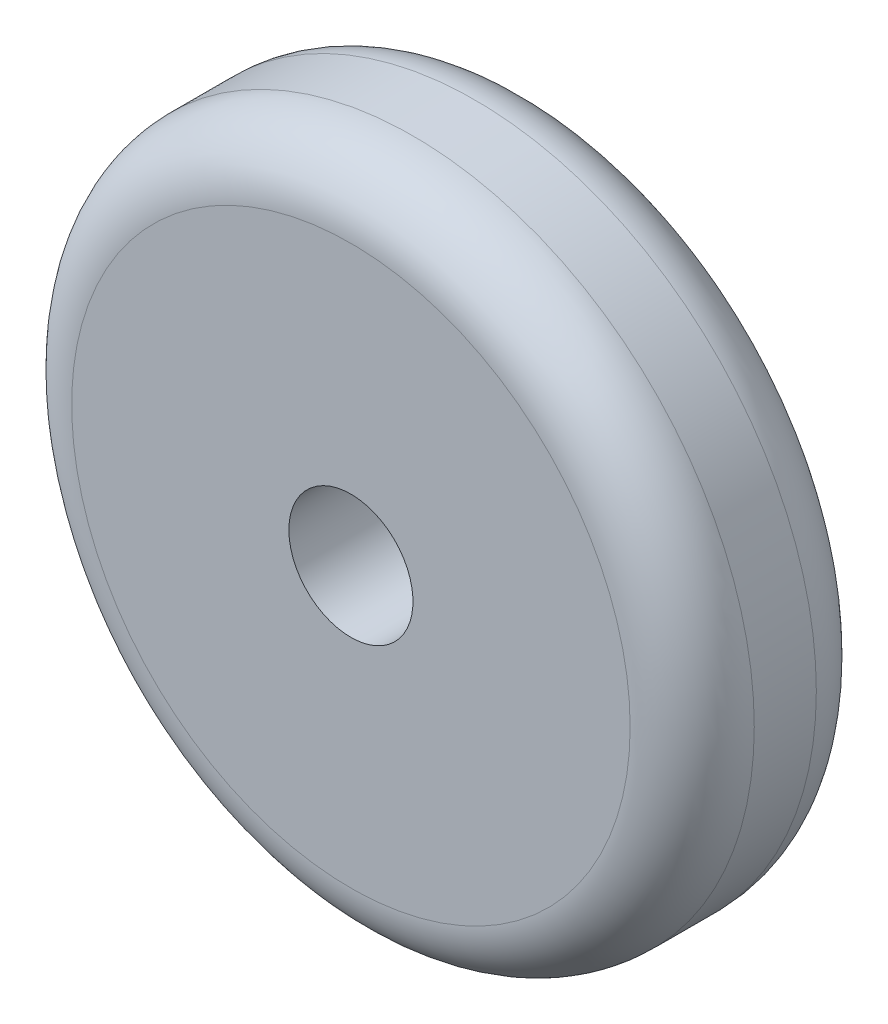
ISO-10303-21;
HEADER;
FILE_DESCRIPTION(('STEP AP214'),'2;1');
FILE_NAME('part.step','',(''),(''),'','','');
FILE_SCHEMA(('AUTOMOTIVE_DESIGN { 1 0 10303 214 1 1 1 1 }'));
ENDSEC;
DATA;
#1=APPLICATION_CONTEXT('core data for automotive mechanical design processes');
#2=APPLICATION_PROTOCOL_DEFINITION('international standard','automotive_design',2000,#1);
#3=PRODUCT_CONTEXT('',#1,'mechanical');
#4=PRODUCT('Part','Part','',(#3));
#5=PRODUCT_RELATED_PRODUCT_CATEGORY('part','',(#4));
#6=PRODUCT_DEFINITION_FORMATION('','',#4);
#7=PRODUCT_DEFINITION_CONTEXT('part definition',#1,'design');
#8=PRODUCT_DEFINITION('design','',#6,#7);
#9=PRODUCT_DEFINITION_SHAPE('','',#8);
#10=(LENGTH_UNIT() NAMED_UNIT(*) SI_UNIT(.MILLI.,.METRE.));
#11=(NAMED_UNIT(*) PLANE_ANGLE_UNIT() SI_UNIT($,.RADIAN.));
#12=(NAMED_UNIT(*) SI_UNIT($,.STERADIAN.) SOLID_ANGLE_UNIT());
#13=UNCERTAINTY_MEASURE_WITH_UNIT(LENGTH_MEASURE(1.E-05),#10,'distance_accuracy_value','');
#14=(GEOMETRIC_REPRESENTATION_CONTEXT(3) GLOBAL_UNCERTAINTY_ASSIGNED_CONTEXT((#13)) GLOBAL_UNIT_ASSIGNED_CONTEXT((#10,
#11,#12)) REPRESENTATION_CONTEXT('',''));
#15=CARTESIAN_POINT('',(0.,0.,0.));
#16=DIRECTION('',(0.,0.,1.));
#17=DIRECTION('',(1.,0.,0.));
#18=AXIS2_PLACEMENT_3D('',#15,#16,#17);
#19=CARTESIAN_POINT('',(0.,0.,7.62));
#20=DIRECTION('',(0.,0.,1.));
#21=DIRECTION('',(1.,0.,0.));
#22=AXIS2_PLACEMENT_3D('',#19,#20,#21);
#23=PLANE('',#22);
#24=CARTESIAN_POINT('',(0.,0.,7.62));
#25=DIRECTION('',(0.,0.,1.));
#26=DIRECTION('',(1.,0.,0.));
#27=AXIS2_PLACEMENT_3D('',#24,#25,#26);
#28=CIRCLE('',#27,11.43);
#29=CARTESIAN_POINT('',(11.43,0.,7.62));
#30=VERTEX_POINT('',#29);
#31=EDGE_CURVE('E10',#30,#30,#28,.T.);
#32=ORIENTED_EDGE('',*,*,#31,.T.);
#33=EDGE_LOOP('',(#32));
#34=FACE_BOUND('',#33,.T.);
#35=CARTESIAN_POINT('',(0.,0.,7.62));
#36=DIRECTION('',(0.,0.,1.));
#37=DIRECTION('',(1.,0.,0.));
#38=AXIS2_PLACEMENT_3D('',#35,#36,#37);
#39=CIRCLE('',#38,2.54);
#40=CARTESIAN_POINT('',(-2.54,0.,7.62));
#41=VERTEX_POINT('',#40);
#42=EDGE_CURVE('E51',#41,#41,#39,.T.);
#43=ORIENTED_EDGE('',*,*,#42,.F.);
#44=EDGE_LOOP('',(#43));
#45=FACE_BOUND('',#44,.T.);
#46=ADVANCED_FACE('F31',(#34,#45),#23,.T.);
#47=CARTESIAN_POINT('',(0.,0.,0.));
#48=DIRECTION('',(0.,0.,1.));
#49=DIRECTION('',(1.,0.,0.));
#50=AXIS2_PLACEMENT_3D('',#47,#48,#49);
#51=PLANE('',#50);
#52=CARTESIAN_POINT('',(0.,0.,0.));
#53=DIRECTION('',(0.,0.,1.));
#54=DIRECTION('',(1.,0.,0.));
#55=AXIS2_PLACEMENT_3D('',#52,#53,#54);
#56=CIRCLE('',#55,11.43);
#57=CARTESIAN_POINT('',(11.43,0.,0.));
#58=VERTEX_POINT('',#57);
#59=EDGE_CURVE('E38',#58,#58,#56,.F.);
#60=ORIENTED_EDGE('',*,*,#59,.T.);
#61=EDGE_LOOP('',(#60));
#62=FACE_BOUND('',#61,.T.);
#63=CARTESIAN_POINT('',(0.,0.,0.));
#64=DIRECTION('',(0.,0.,1.));
#65=DIRECTION('',(1.,0.,0.));
#66=AXIS2_PLACEMENT_3D('',#63,#64,#65);
#67=CIRCLE('',#66,2.54);
#68=CARTESIAN_POINT('',(-2.54,0.,0.));
#69=VERTEX_POINT('',#68);
#70=EDGE_CURVE('E52',#69,#69,#67,.T.);
#71=ORIENTED_EDGE('',*,*,#70,.T.);
#72=EDGE_LOOP('',(#71));
#73=FACE_BOUND('',#72,.T.);
#74=ADVANCED_FACE('F62',(#62,#73),#51,.F.);
#75=CARTESIAN_POINT('',(0.,0.,7.62));
#76=DIRECTION('',(0.,0.,-1.));
#77=DIRECTION('',(-1.,0.,0.));
#78=AXIS2_PLACEMENT_3D('',#75,#76,#77);
#79=CYLINDRICAL_SURFACE('',#78,13.97);
#80=CARTESIAN_POINT('',(0.,0.,2.54));
#81=DIRECTION('',(0.,0.,1.));
#82=DIRECTION('',(1.,0.,0.));
#83=AXIS2_PLACEMENT_3D('',#80,#81,#82);
#84=CIRCLE('',#83,13.97);
#85=CARTESIAN_POINT('',(-13.97,0.,2.54));
#86=VERTEX_POINT('',#85);
#87=EDGE_CURVE('E42',#86,#86,#84,.T.);
#88=CARTESIAN_POINT('',(0.,0.,5.08));
#89=DIRECTION('',(0.,0.,1.));
#90=DIRECTION('',(1.,0.,0.));
#91=AXIS2_PLACEMENT_3D('',#88,#89,#90);
#92=CIRCLE('',#91,13.97);
#93=CARTESIAN_POINT('',(-13.97,0.,5.08));
#94=VERTEX_POINT('',#93);
#95=EDGE_CURVE('E46',#94,#94,#92,.F.);
#96=CARTESIAN_POINT('',(-13.97,0.,2.54));
#97=CARTESIAN_POINT('',(-13.97,0.,2.56645833333333));
#98=CARTESIAN_POINT('',(-13.97,0.,2.59291666666667));
#99=CARTESIAN_POINT('',(-13.97,0.,2.64583333333333));
#100=CARTESIAN_POINT('',(-13.97,0.,2.67229166666667));
#101=CARTESIAN_POINT('',(-13.97,0.,2.72520833333333));
#102=CARTESIAN_POINT('',(-13.97,0.,2.75166666666667));
#103=CARTESIAN_POINT('',(-13.97,0.,2.80458333333333));
#104=CARTESIAN_POINT('',(-13.97,0.,2.83104166666667));
#105=CARTESIAN_POINT('',(-13.97,0.,2.88395833333333));
#106=CARTESIAN_POINT('',(-13.97,0.,2.91041666666667));
#107=CARTESIAN_POINT('',(-13.97,0.,2.96333333333333));
#108=CARTESIAN_POINT('',(-13.97,0.,2.98979166666667));
#109=CARTESIAN_POINT('',(-13.97,0.,3.04270833333333));
#110=CARTESIAN_POINT('',(-13.97,0.,3.06916666666667));
#111=CARTESIAN_POINT('',(-13.97,0.,3.12208333333333));
#112=CARTESIAN_POINT('',(-13.97,0.,3.14854166666667));
#113=CARTESIAN_POINT('',(-13.97,0.,3.20145833333333));
#114=CARTESIAN_POINT('',(-13.97,0.,3.22791666666667));
#115=CARTESIAN_POINT('',(-13.97,0.,3.28083333333333));
#116=CARTESIAN_POINT('',(-13.97,0.,3.30729166666667));
#117=CARTESIAN_POINT('',(-13.97,0.,3.36020833333333));
#118=CARTESIAN_POINT('',(-13.97,0.,3.38666666666667));
#119=CARTESIAN_POINT('',(-13.97,0.,3.43958333333333));
#120=CARTESIAN_POINT('',(-13.97,0.,3.46604166666667));
#121=CARTESIAN_POINT('',(-13.97,0.,3.51895833333333));
#122=CARTESIAN_POINT('',(-13.97,0.,3.54541666666667));
#123=CARTESIAN_POINT('',(-13.97,0.,3.59833333333333));
#124=CARTESIAN_POINT('',(-13.97,0.,3.62479166666667));
#125=CARTESIAN_POINT('',(-13.97,0.,3.67770833333333));
#126=CARTESIAN_POINT('',(-13.97,0.,3.70416666666667));
#127=CARTESIAN_POINT('',(-13.97,0.,3.75708333333333));
#128=CARTESIAN_POINT('',(-13.97,0.,3.78354166666667));
#129=CARTESIAN_POINT('',(-13.97,0.,3.83645833333333));
#130=CARTESIAN_POINT('',(-13.97,0.,3.86291666666667));
#131=CARTESIAN_POINT('',(-13.97,0.,3.91583333333333));
#132=CARTESIAN_POINT('',(-13.97,0.,3.94229166666666));
#133=CARTESIAN_POINT('',(-13.97,0.,3.99520833333333));
#134=CARTESIAN_POINT('',(-13.97,0.,4.02166666666667));
#135=CARTESIAN_POINT('',(-13.97,0.,4.07458333333333));
#136=CARTESIAN_POINT('',(-13.97,0.,4.10104166666667));
#137=CARTESIAN_POINT('',(-13.97,0.,4.15395833333333));
#138=CARTESIAN_POINT('',(-13.97,0.,4.18041666666667));
#139=CARTESIAN_POINT('',(-13.97,0.,4.23333333333333));
#140=CARTESIAN_POINT('',(-13.97,0.,4.25979166666666));
#141=CARTESIAN_POINT('',(-13.97,0.,4.31270833333333));
#142=CARTESIAN_POINT('',(-13.97,0.,4.33916666666667));
#143=CARTESIAN_POINT('',(-13.97,0.,4.39208333333333));
#144=CARTESIAN_POINT('',(-13.97,0.,4.41854166666667));
#145=CARTESIAN_POINT('',(-13.97,0.,4.47145833333333));
#146=CARTESIAN_POINT('',(-13.97,0.,4.49791666666667));
#147=CARTESIAN_POINT('',(-13.97,0.,4.55083333333333));
#148=CARTESIAN_POINT('',(-13.97,0.,4.57729166666667));
#149=CARTESIAN_POINT('',(-13.97,0.,4.63020833333333));
#150=CARTESIAN_POINT('',(-13.97,0.,4.65666666666667));
#151=CARTESIAN_POINT('',(-13.97,0.,4.70958333333333));
#152=CARTESIAN_POINT('',(-13.97,0.,4.73604166666667));
#153=CARTESIAN_POINT('',(-13.97,0.,4.78895833333333));
#154=CARTESIAN_POINT('',(-13.97,0.,4.81541666666667));
#155=CARTESIAN_POINT('',(-13.97,0.,4.86833333333333));
#156=CARTESIAN_POINT('',(-13.97,0.,4.89479166666667));
#157=CARTESIAN_POINT('',(-13.97,0.,4.94770833333333));
#158=CARTESIAN_POINT('',(-13.97,0.,4.97416666666667));
#159=CARTESIAN_POINT('',(-13.97,0.,5.02708333333333));
#160=CARTESIAN_POINT('',(-13.97,0.,5.05354166666667));
#161=CARTESIAN_POINT('',(-13.97,0.,5.08));
#162=B_SPLINE_CURVE_WITH_KNOTS('',3,(#96,#97,#98,#99,#100,#101,#102,#103,#104,#105,#106,#107,
#108,#109,#110,#111,#112,#113,#114,#115,#116,#117,#118,#119,#120,#121,#122,#123,#124,#125,#126,
#127,#128,#129,#130,#131,#132,#133,#134,#135,#136,#137,#138,#139,#140,#141,#142,#143,#144,#145,
#146,#147,#148,#149,#150,#151,#152,#153,#154,#155,#156,#157,#158,#159,#160,#161),.UNSPECIFIED.,
.F.,.F.,(4,2,2,2,2,2,2,2,2,2,2,2,2,2,2,2,2,2,2,2,2,2,2,2,2,2,2,2,2,2,2,2,4),(0.,
0.0793749999999996,0.15875,0.238125,0.3175,0.396875,0.47625,0.555625000000001,0.635,0.714375,
0.79375,0.873125000000001,0.9525,1.031875,1.11125,1.190625,1.27,1.349375,1.42875,1.508125,
1.5875,1.666875,1.74625,1.825625,1.905,1.984375,2.06375,2.143125,2.2225,2.301875,2.38125,
2.460625,2.54),.UNSPECIFIED.);
#163=EDGE_CURVE('BSEAM67',#86,#94,#162,.T.);
#164=ORIENTED_EDGE('',*,*,#87,.T.);
#165=ORIENTED_EDGE('',*,*,#95,.T.);
#166=ORIENTED_EDGE('',*,*,#163,.T.);
#167=ORIENTED_EDGE('',*,*,#163,.F.);
#168=EDGE_LOOP('',(#164,#166,#165,#167));
#169=FACE_BOUND('',#168,.T.);
#170=ADVANCED_FACE('F67',(#169),#79,.T.);
#171=CARTESIAN_POINT('',(0.,0.,7.62));
#172=DIRECTION('',(0.,0.,-1.));
#173=DIRECTION('',(-1.,0.,0.));
#174=AXIS2_PLACEMENT_3D('',#171,#172,#173);
#175=CYLINDRICAL_SURFACE('',#174,2.54);
#176=CARTESIAN_POINT('',(-2.54,0.,7.62));
#177=CARTESIAN_POINT('',(-2.54,0.,7.540625));
#178=CARTESIAN_POINT('',(-2.54,0.,7.46125));
#179=CARTESIAN_POINT('',(-2.54,0.,7.3025));
#180=CARTESIAN_POINT('',(-2.54,0.,7.223125));
#181=CARTESIAN_POINT('',(-2.54,0.,7.064375));
#182=CARTESIAN_POINT('',(-2.54,0.,6.985));
#183=CARTESIAN_POINT('',(-2.54,0.,6.82625));
#184=CARTESIAN_POINT('',(-2.54,0.,6.746875));
#185=CARTESIAN_POINT('',(-2.54,0.,6.588125));
#186=CARTESIAN_POINT('',(-2.54,0.,6.50875));
#187=CARTESIAN_POINT('',(-2.54,0.,6.35));
#188=CARTESIAN_POINT('',(-2.54,0.,6.270625));
#189=CARTESIAN_POINT('',(-2.54,0.,6.111875));
#190=CARTESIAN_POINT('',(-2.54,0.,6.0325));
#191=CARTESIAN_POINT('',(-2.54,0.,5.87375));
#192=CARTESIAN_POINT('',(-2.54,0.,5.794375));
#193=CARTESIAN_POINT('',(-2.54,0.,5.635625));
#194=CARTESIAN_POINT('',(-2.54,0.,5.55625));
#195=CARTESIAN_POINT('',(-2.54,0.,5.3975));
#196=CARTESIAN_POINT('',(-2.54,0.,5.318125));
#197=CARTESIAN_POINT('',(-2.54,0.,5.159375));
#198=CARTESIAN_POINT('',(-2.54,0.,5.08));
#199=CARTESIAN_POINT('',(-2.54,0.,4.92125));
#200=CARTESIAN_POINT('',(-2.54,0.,4.841875));
#201=CARTESIAN_POINT('',(-2.54,0.,4.683125));
#202=CARTESIAN_POINT('',(-2.54,0.,4.60375));
#203=CARTESIAN_POINT('',(-2.54,0.,4.445));
#204=CARTESIAN_POINT('',(-2.54,0.,4.365625));
#205=CARTESIAN_POINT('',(-2.54,0.,4.206875));
#206=CARTESIAN_POINT('',(-2.54,0.,4.1275));
#207=CARTESIAN_POINT('',(-2.54,0.,3.96875));
#208=CARTESIAN_POINT('',(-2.54,0.,3.889375));
#209=CARTESIAN_POINT('',(-2.54,0.,3.730625));
#210=CARTESIAN_POINT('',(-2.54,0.,3.65125));
#211=CARTESIAN_POINT('',(-2.54,0.,3.4925));
#212=CARTESIAN_POINT('',(-2.54,0.,3.413125));
#213=CARTESIAN_POINT('',(-2.54,0.,3.254375));
#214=CARTESIAN_POINT('',(-2.54,0.,3.175));
#215=CARTESIAN_POINT('',(-2.54,0.,3.01625));
#216=CARTESIAN_POINT('',(-2.54,0.,2.936875));
#217=CARTESIAN_POINT('',(-2.54,0.,2.778125));
#218=CARTESIAN_POINT('',(-2.54,0.,2.69875));
#219=CARTESIAN_POINT('',(-2.54,0.,2.54));
#220=CARTESIAN_POINT('',(-2.54,0.,2.460625));
#221=CARTESIAN_POINT('',(-2.54,0.,2.301875));
#222=CARTESIAN_POINT('',(-2.54,0.,2.2225));
#223=CARTESIAN_POINT('',(-2.54,0.,2.06375));
#224=CARTESIAN_POINT('',(-2.54,0.,1.984375));
#225=CARTESIAN_POINT('',(-2.54,0.,1.825625));
#226=CARTESIAN_POINT('',(-2.54,0.,1.74625));
#227=CARTESIAN_POINT('',(-2.54,0.,1.5875));
#228=CARTESIAN_POINT('',(-2.54,0.,1.508125));
#229=CARTESIAN_POINT('',(-2.54,0.,1.349375));
#230=CARTESIAN_POINT('',(-2.54,0.,1.27));
#231=CARTESIAN_POINT('',(-2.54,0.,1.11125));
#232=CARTESIAN_POINT('',(-2.54,0.,1.031875));
#233=CARTESIAN_POINT('',(-2.54,0.,0.873125));
#234=CARTESIAN_POINT('',(-2.54,0.,0.79375));
#235=CARTESIAN_POINT('',(-2.54,0.,0.635));
#236=CARTESIAN_POINT('',(-2.54,0.,0.555625));
#237=CARTESIAN_POINT('',(-2.54,0.,0.396875));
#238=CARTESIAN_POINT('',(-2.54,0.,0.3175));
#239=CARTESIAN_POINT('',(-2.54,0.,0.15875));
#240=CARTESIAN_POINT('',(-2.54,0.,0.0793749999999999));
#241=CARTESIAN_POINT('',(-2.54,0.,0.));
#242=B_SPLINE_CURVE_WITH_KNOTS('',3,(#176,#177,#178,#179,#180,#181,#182,#183,#184,#185,#186,
#187,#188,#189,#190,#191,#192,#193,#194,#195,#196,#197,#198,#199,#200,#201,#202,#203,#204,#205,
#206,#207,#208,#209,#210,#211,#212,#213,#214,#215,#216,#217,#218,#219,#220,#221,#222,#223,#224,
#225,#226,#227,#228,#229,#230,#231,#232,#233,#234,#235,#236,#237,#238,#239,#240,#241),
.UNSPECIFIED.,.F.,.F.,(4,2,2,2,2,2,2,2,2,2,2,2,2,2,2,2,2,2,2,2,2,2,2,2,2,2,2,2,2,2,2,2,4),(0.,
0.238125,0.47625,0.714375000000001,0.9525,1.190625,1.42875,1.666875,1.905,2.143125,2.38125,
2.619375,2.8575,3.095625,3.33375,3.571875,3.81,4.048125,4.28625,4.524375,4.7625,5.000625,
5.23875,5.476875,5.715,5.953125,6.19125,6.429375,6.6675,6.905625,7.14375,7.381875,7.62),.UNSPECIFIED.);
#243=EDGE_CURVE('BSEAM58',#41,#69,#242,.T.);
#244=ORIENTED_EDGE('',*,*,#42,.T.);
#245=ORIENTED_EDGE('',*,*,#70,.F.);
#246=ORIENTED_EDGE('',*,*,#243,.T.);
#247=ORIENTED_EDGE('',*,*,#243,.F.);
#248=EDGE_LOOP('',(#244,#246,#245,#247));
#249=FACE_BOUND('',#248,.T.);
#250=ADVANCED_FACE('F58',(#249),#175,.F.);
#251=CARTESIAN_POINT('',(0.,0.,2.54));
#252=DIRECTION('',(0.,0.,1.));
#253=DIRECTION('',(1.,0.,0.));
#254=AXIS2_PLACEMENT_3D('',#251,#252,#253);
#255=TOROIDAL_SURFACE('',#254,11.43,2.54);
#256=ORIENTED_EDGE('',*,*,#59,.F.);
#257=EDGE_LOOP('',(#256));
#258=FACE_BOUND('',#257,.T.);
#259=ORIENTED_EDGE('',*,*,#87,.F.);
#260=EDGE_LOOP('',(#259));
#261=FACE_BOUND('',#260,.T.);
#262=ADVANCED_FACE('F73',(#258,#261),#255,.T.);
#263=CARTESIAN_POINT('',(0.,0.,5.08));
#264=DIRECTION('',(0.,0.,1.));
#265=DIRECTION('',(1.,0.,0.));
#266=AXIS2_PLACEMENT_3D('',#263,#264,#265);
#267=TOROIDAL_SURFACE('',#266,11.43,2.54);
#268=ORIENTED_EDGE('',*,*,#95,.F.);
#269=EDGE_LOOP('',(#268));
#270=FACE_BOUND('',#269,.T.);
#271=ORIENTED_EDGE('',*,*,#31,.F.);
#272=EDGE_LOOP('',(#271));
#273=FACE_BOUND('',#272,.T.);
#274=ADVANCED_FACE('F33',(#270,#273),#267,.T.);
#275=CLOSED_SHELL('',(#46,#74,#170,#250,#262,#274));
#276=MANIFOLD_SOLID_BREP('B2',#275);
#277=ADVANCED_BREP_SHAPE_REPRESENTATION('',(#18,#276),#14);
#278=SHAPE_DEFINITION_REPRESENTATION(#9,#277);
ENDSEC;
END-ISO-10303-21;
